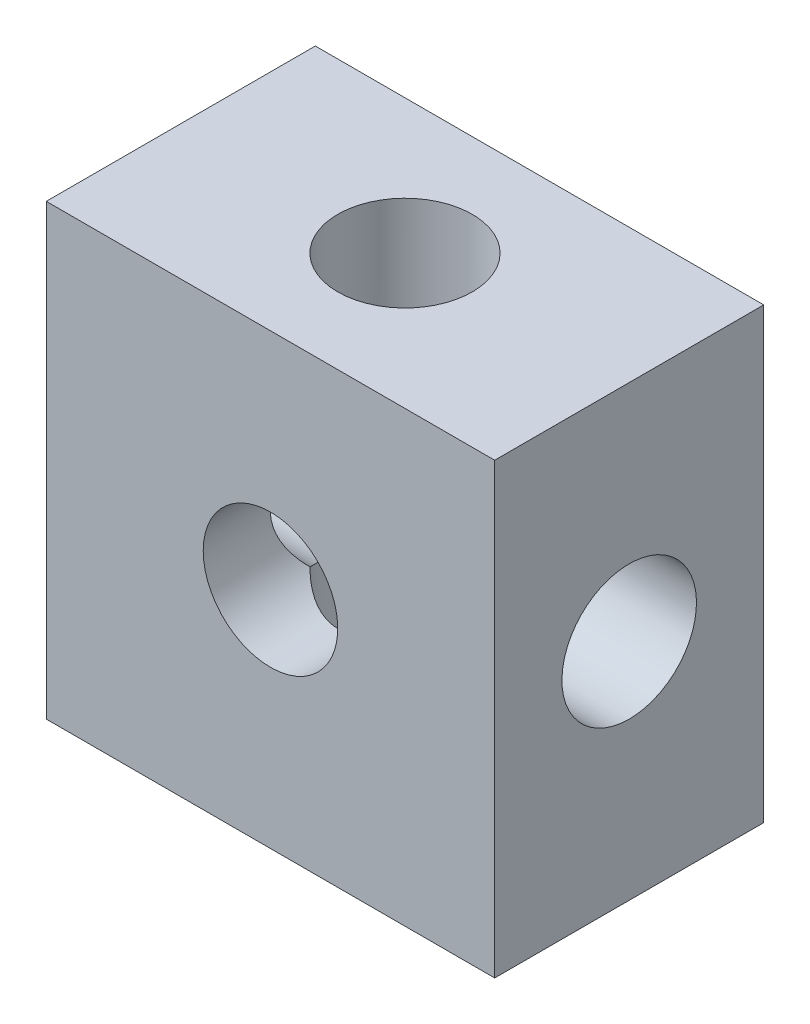
ISO-10303-21;
HEADER;
FILE_DESCRIPTION(('STEP AP214'),'2;1');
FILE_NAME('part.step','',(''),(''),'','','');
FILE_SCHEMA(('AUTOMOTIVE_DESIGN { 1 0 10303 214 1 1 1 1 }'));
ENDSEC;
DATA;
#1=APPLICATION_CONTEXT('core data for automotive mechanical design processes');
#2=APPLICATION_PROTOCOL_DEFINITION('international standard','automotive_design',2000,#1);
#3=PRODUCT_CONTEXT('',#1,'mechanical');
#4=PRODUCT('Part','Part','',(#3));
#5=PRODUCT_RELATED_PRODUCT_CATEGORY('part','',(#4));
#6=PRODUCT_DEFINITION_FORMATION('','',#4);
#7=PRODUCT_DEFINITION_CONTEXT('part definition',#1,'design');
#8=PRODUCT_DEFINITION('design','',#6,#7);
#9=PRODUCT_DEFINITION_SHAPE('','',#8);
#10=(LENGTH_UNIT() NAMED_UNIT(*) SI_UNIT(.MILLI.,.METRE.));
#11=(NAMED_UNIT(*) PLANE_ANGLE_UNIT() SI_UNIT($,.RADIAN.));
#12=(NAMED_UNIT(*) SI_UNIT($,.STERADIAN.) SOLID_ANGLE_UNIT());
#13=UNCERTAINTY_MEASURE_WITH_UNIT(LENGTH_MEASURE(1.E-05),#10,'distance_accuracy_value','');
#14=(GEOMETRIC_REPRESENTATION_CONTEXT(3) GLOBAL_UNCERTAINTY_ASSIGNED_CONTEXT((#13)) GLOBAL_UNIT_ASSIGNED_CONTEXT((#10,
#11,#12)) REPRESENTATION_CONTEXT('',''));
#15=CARTESIAN_POINT('',(0.,0.,0.));
#16=DIRECTION('',(0.,0.,1.));
#17=DIRECTION('',(1.,0.,0.));
#18=AXIS2_PLACEMENT_3D('',#15,#16,#17);
#19=CARTESIAN_POINT('',(0.,-5.,0.));
#20=DIRECTION('',(0.,1.,0.));
#21=DIRECTION('',(0.,0.,1.));
#22=AXIS2_PLACEMENT_3D('',#19,#20,#21);
#23=CYLINDRICAL_SURFACE('',#22,1.5);
#24=CARTESIAN_POINT('',(0.,5.,0.));
#25=DIRECTION('',(0.,1.,0.));
#26=DIRECTION('',(0.,0.,1.));
#27=AXIS2_PLACEMENT_3D('',#24,#25,#26);
#28=CIRCLE('',#27,1.5);
#29=CARTESIAN_POINT('',(0.,5.,1.5));
#30=VERTEX_POINT('',#29);
#31=EDGE_CURVE('E139',#30,#30,#28,.T.);
#32=ORIENTED_EDGE('',*,*,#31,.T.);
#33=EDGE_LOOP('',(#32));
#34=FACE_BOUND('',#33,.T.);
#35=CARTESIAN_POINT('',(0.,0.,0.));
#36=DIRECTION('',(-0.707106781186548,0.707106781186547,0.));
#37=DIRECTION('',(0.707106781186547,0.707106781186547,0.));
#38=AXIS2_PLACEMENT_3D('',#35,#36,#37);
#39=ELLIPSE('',#38,2.12132034355964,1.5);
#40=CARTESIAN_POINT('',(1.06066017177982,1.06066017177982,-1.06066017177982));
#41=VERTEX_POINT('',#40);
#42=CARTESIAN_POINT('',(1.06066017177982,1.06066017177982,1.06066017177982));
#43=VERTEX_POINT('',#42);
#44=EDGE_CURVE('E103',#41,#43,#39,.F.);
#45=ORIENTED_EDGE('',*,*,#44,.T.);
#46=CARTESIAN_POINT('',(0.,0.,0.));
#47=DIRECTION('',(0.,0.707106781186547,-0.707106781186547));
#48=DIRECTION('',(0.,0.707106781186547,0.707106781186547));
#49=AXIS2_PLACEMENT_3D('',#46,#47,#48);
#50=ELLIPSE('',#49,2.12132034355964,1.5);
#51=CARTESIAN_POINT('',(-1.06066017177982,1.06066017177982,1.06066017177982));
#52=VERTEX_POINT('',#51);
#53=EDGE_CURVE('E49',#43,#52,#50,.F.);
#54=ORIENTED_EDGE('',*,*,#53,.T.);
#55=CARTESIAN_POINT('',(0.,0.,0.));
#56=DIRECTION('',(0.707106781186547,0.707106781186547,0.));
#57=DIRECTION('',(-0.707106781186548,0.707106781186547,0.));
#58=AXIS2_PLACEMENT_3D('',#55,#56,#57);
#59=ELLIPSE('',#58,2.12132034355964,1.5);
#60=CARTESIAN_POINT('',(-1.06066017177982,1.06066017177982,-1.06066017177982));
#61=VERTEX_POINT('',#60);
#62=EDGE_CURVE('E115',#52,#61,#59,.F.);
#63=ORIENTED_EDGE('',*,*,#62,.T.);
#64=CARTESIAN_POINT('',(0.,0.,0.));
#65=DIRECTION('',(0.,0.707106781186547,0.707106781186547));
#66=DIRECTION('',(0.,0.707106781186547,-0.707106781186547));
#67=AXIS2_PLACEMENT_3D('',#64,#65,#66);
#68=ELLIPSE('',#67,2.12132034355964,1.5);
#69=EDGE_CURVE('E126',#61,#41,#68,.F.);
#70=ORIENTED_EDGE('',*,*,#69,.T.);
#71=EDGE_LOOP('',(#45,#54,#63,#70));
#72=FACE_BOUND('',#71,.T.);
#73=ADVANCED_FACE('F34',(#34,#72),#23,.F.);
#74=CARTESIAN_POINT('',(5.,5.,3.));
#75=DIRECTION('',(-1.,0.,0.));
#76=DIRECTION('',(0.,0.,1.));
#77=AXIS2_PLACEMENT_3D('',#74,#75,#76);
#78=PLANE('',#77);
#79=CARTESIAN_POINT('',(5.,0.,0.));
#80=DIRECTION('',(-1.,0.,0.));
#81=DIRECTION('',(0.,-1.,0.));
#82=AXIS2_PLACEMENT_3D('',#79,#80,#81);
#83=CIRCLE('',#82,1.5);
#84=CARTESIAN_POINT('',(5.,-1.5,0.));
#85=VERTEX_POINT('',#84);
#86=EDGE_CURVE('E136',#85,#85,#83,.T.);
#87=ORIENTED_EDGE('',*,*,#86,.T.);
#88=EDGE_LOOP('',(#87));
#89=FACE_BOUND('',#88,.T.);
#90=DIRECTION('',(0.,1.,0.));
#91=VECTOR('',#90,1.);
#92=CARTESIAN_POINT('',(5.,5.,-3.));
#93=LINE('',#92,#91);
#94=CARTESIAN_POINT('',(5.,-5.,-3.));
#95=VERTEX_POINT('',#94);
#96=CARTESIAN_POINT('',(5.,5.,-3.));
#97=VERTEX_POINT('',#96);
#98=EDGE_CURVE('E145',#95,#97,#93,.T.);
#99=ORIENTED_EDGE('',*,*,#98,.T.);
#100=DIRECTION('',(0.,0.,-1.));
#101=VECTOR('',#100,1.);
#102=CARTESIAN_POINT('',(5.,5.,3.));
#103=LINE('',#102,#101);
#104=CARTESIAN_POINT('',(5.,5.,3.));
#105=VERTEX_POINT('',#104);
#106=EDGE_CURVE('E119',#105,#97,#103,.T.);
#107=ORIENTED_EDGE('',*,*,#106,.F.);
#108=DIRECTION('',(0.,1.,0.));
#109=VECTOR('',#108,1.);
#110=CARTESIAN_POINT('',(5.,5.,3.));
#111=LINE('',#110,#109);
#112=CARTESIAN_POINT('',(5.,-5.,3.));
#113=VERTEX_POINT('',#112);
#114=EDGE_CURVE('E148',#113,#105,#111,.T.);
#115=ORIENTED_EDGE('',*,*,#114,.F.);
#116=DIRECTION('',(0.,0.,-1.));
#117=VECTOR('',#116,1.);
#118=CARTESIAN_POINT('',(5.,-5.,3.));
#119=LINE('',#118,#117);
#120=EDGE_CURVE('E158',#113,#95,#119,.T.);
#121=ORIENTED_EDGE('',*,*,#120,.T.);
#122=EDGE_LOOP('',(#99,#107,#115,#121));
#123=FACE_BOUND('',#122,.T.);
#124=ADVANCED_FACE('F36',(#89,#123),#78,.F.);
#125=CARTESIAN_POINT('',(-5.,5.,3.));
#126=DIRECTION('',(0.,-1.,0.));
#127=DIRECTION('',(0.,0.,-1.));
#128=AXIS2_PLACEMENT_3D('',#125,#126,#127);
#129=PLANE('',#128);
#130=ORIENTED_EDGE('',*,*,#31,.F.);
#131=EDGE_LOOP('',(#130));
#132=FACE_BOUND('',#131,.T.);
#133=DIRECTION('',(-1.,0.,0.));
#134=VECTOR('',#133,1.);
#135=CARTESIAN_POINT('',(-5.,5.,-3.));
#136=LINE('',#135,#134);
#137=CARTESIAN_POINT('',(-5.,5.,-3.));
#138=VERTEX_POINT('',#137);
#139=EDGE_CURVE('E161',#97,#138,#136,.T.);
#140=ORIENTED_EDGE('',*,*,#139,.T.);
#141=DIRECTION('',(0.,0.,-1.));
#142=VECTOR('',#141,1.);
#143=CARTESIAN_POINT('',(-5.,5.,3.));
#144=LINE('',#143,#142);
#145=CARTESIAN_POINT('',(-5.,5.,3.));
#146=VERTEX_POINT('',#145);
#147=EDGE_CURVE('E171',#146,#138,#144,.T.);
#148=ORIENTED_EDGE('',*,*,#147,.F.);
#149=DIRECTION('',(-1.,0.,0.));
#150=VECTOR('',#149,1.);
#151=CARTESIAN_POINT('',(-5.,5.,3.));
#152=LINE('',#151,#150);
#153=EDGE_CURVE('E151',#105,#146,#152,.T.);
#154=ORIENTED_EDGE('',*,*,#153,.F.);
#155=ORIENTED_EDGE('',*,*,#106,.T.);
#156=EDGE_LOOP('',(#140,#148,#154,#155));
#157=FACE_BOUND('',#156,.T.);
#158=ADVANCED_FACE('F176',(#132,#157),#129,.F.);
#159=CARTESIAN_POINT('',(-5.,5.,3.));
#160=DIRECTION('',(1.,0.,0.));
#161=DIRECTION('',(0.,1.,0.));
#162=AXIS2_PLACEMENT_3D('',#159,#160,#161);
#163=PLANE('',#162);
#164=CARTESIAN_POINT('',(-5.,0.,0.));
#165=DIRECTION('',(-1.,0.,0.));
#166=DIRECTION('',(0.,-1.,0.));
#167=AXIS2_PLACEMENT_3D('',#164,#165,#166);
#168=CIRCLE('',#167,1.5);
#169=CARTESIAN_POINT('',(-5.,-1.5,0.));
#170=VERTEX_POINT('',#169);
#171=EDGE_CURVE('E130',#170,#170,#168,.T.);
#172=ORIENTED_EDGE('',*,*,#171,.F.);
#173=EDGE_LOOP('',(#172));
#174=FACE_BOUND('',#173,.T.);
#175=DIRECTION('',(0.,-1.,0.));
#176=VECTOR('',#175,1.);
#177=CARTESIAN_POINT('',(-5.,5.,-3.));
#178=LINE('',#177,#176);
#179=CARTESIAN_POINT('',(-5.,-5.,-3.));
#180=VERTEX_POINT('',#179);
#181=EDGE_CURVE('E163',#138,#180,#178,.T.);
#182=ORIENTED_EDGE('',*,*,#181,.T.);
#183=DIRECTION('',(0.,0.,-1.));
#184=VECTOR('',#183,1.);
#185=CARTESIAN_POINT('',(-5.,-5.,3.));
#186=LINE('',#185,#184);
#187=CARTESIAN_POINT('',(-5.,-5.,3.));
#188=VERTEX_POINT('',#187);
#189=EDGE_CURVE('E168',#188,#180,#186,.T.);
#190=ORIENTED_EDGE('',*,*,#189,.F.);
#191=DIRECTION('',(0.,-1.,0.));
#192=VECTOR('',#191,1.);
#193=CARTESIAN_POINT('',(-5.,5.,3.));
#194=LINE('',#193,#192);
#195=EDGE_CURVE('E154',#146,#188,#194,.T.);
#196=ORIENTED_EDGE('',*,*,#195,.F.);
#197=ORIENTED_EDGE('',*,*,#147,.T.);
#198=EDGE_LOOP('',(#182,#190,#196,#197));
#199=FACE_BOUND('',#198,.T.);
#200=ADVANCED_FACE('F188',(#174,#199),#163,.F.);
#201=CARTESIAN_POINT('',(-5.,-5.,3.));
#202=DIRECTION('',(0.,1.,0.));
#203=DIRECTION('',(0.,0.,1.));
#204=AXIS2_PLACEMENT_3D('',#201,#202,#203);
#205=PLANE('',#204);
#206=CARTESIAN_POINT('',(0.,-5.,0.));
#207=DIRECTION('',(0.,1.,0.));
#208=DIRECTION('',(0.,0.,1.));
#209=AXIS2_PLACEMENT_3D('',#206,#207,#208);
#210=CIRCLE('',#209,1.5);
#211=CARTESIAN_POINT('',(0.,-5.,1.5));
#212=VERTEX_POINT('',#211);
#213=EDGE_CURVE('E142',#212,#212,#210,.T.);
#214=ORIENTED_EDGE('',*,*,#213,.T.);
#215=EDGE_LOOP('',(#214));
#216=FACE_BOUND('',#215,.T.);
#217=DIRECTION('',(1.,0.,0.));
#218=VECTOR('',#217,1.);
#219=CARTESIAN_POINT('',(-5.,-5.,-3.));
#220=LINE('',#219,#218);
#221=EDGE_CURVE('E152',#180,#95,#220,.T.);
#222=ORIENTED_EDGE('',*,*,#221,.T.);
#223=ORIENTED_EDGE('',*,*,#120,.F.);
#224=DIRECTION('',(1.,0.,0.));
#225=VECTOR('',#224,1.);
#226=CARTESIAN_POINT('',(-5.,-5.,3.));
#227=LINE('',#226,#225);
#228=EDGE_CURVE('E156',#188,#113,#227,.T.);
#229=ORIENTED_EDGE('',*,*,#228,.F.);
#230=ORIENTED_EDGE('',*,*,#189,.T.);
#231=EDGE_LOOP('',(#222,#223,#229,#230));
#232=FACE_BOUND('',#231,.T.);
#233=ADVANCED_FACE('F192',(#216,#232),#205,.F.);
#234=CARTESIAN_POINT('',(0.,0.,3.));
#235=DIRECTION('',(0.,0.,1.));
#236=DIRECTION('',(1.,0.,0.));
#237=AXIS2_PLACEMENT_3D('',#234,#235,#236);
#238=PLANE('',#237);
#239=CARTESIAN_POINT('',(0.,0.,3.));
#240=DIRECTION('',(0.,0.,-1.));
#241=DIRECTION('',(-1.,0.,0.));
#242=AXIS2_PLACEMENT_3D('',#239,#240,#241);
#243=CIRCLE('',#242,1.5);
#244=CARTESIAN_POINT('',(-1.5,0.,3.));
#245=VERTEX_POINT('',#244);
#246=EDGE_CURVE('E112',#245,#245,#243,.T.);
#247=ORIENTED_EDGE('',*,*,#246,.T.);
#248=EDGE_LOOP('',(#247));
#249=FACE_BOUND('',#248,.T.);
#250=ORIENTED_EDGE('',*,*,#114,.T.);
#251=ORIENTED_EDGE('',*,*,#153,.T.);
#252=ORIENTED_EDGE('',*,*,#195,.T.);
#253=ORIENTED_EDGE('',*,*,#228,.T.);
#254=EDGE_LOOP('',(#250,#251,#252,#253));
#255=FACE_BOUND('',#254,.T.);
#256=ADVANCED_FACE('F194',(#249,#255),#238,.T.);
#257=CARTESIAN_POINT('',(0.,0.,-3.));
#258=DIRECTION('',(0.,0.,1.));
#259=DIRECTION('',(1.,0.,0.));
#260=AXIS2_PLACEMENT_3D('',#257,#258,#259);
#261=PLANE('',#260);
#262=CARTESIAN_POINT('',(0.,0.,-3.));
#263=DIRECTION('',(0.,0.,-1.));
#264=DIRECTION('',(-1.,0.,0.));
#265=AXIS2_PLACEMENT_3D('',#262,#263,#264);
#266=CIRCLE('',#265,1.5);
#267=CARTESIAN_POINT('',(-1.5,0.,-3.));
#268=VERTEX_POINT('',#267);
#269=EDGE_CURVE('E236',#268,#268,#266,.T.);
#270=ORIENTED_EDGE('',*,*,#269,.F.);
#271=EDGE_LOOP('',(#270));
#272=FACE_BOUND('',#271,.T.);
#273=ORIENTED_EDGE('',*,*,#98,.F.);
#274=ORIENTED_EDGE('',*,*,#221,.F.);
#275=ORIENTED_EDGE('',*,*,#181,.F.);
#276=ORIENTED_EDGE('',*,*,#139,.F.);
#277=EDGE_LOOP('',(#273,#274,#275,#276));
#278=FACE_BOUND('',#277,.T.);
#279=ADVANCED_FACE('F184',(#272,#278),#261,.F.);
#280=CARTESIAN_POINT('',(0.,0.,0.));
#281=DIRECTION('',(0.707106781186547,0.707106781186547,0.));
#282=DIRECTION('',(-0.707106781186548,0.707106781186547,0.));
#283=AXIS2_PLACEMENT_3D('',#280,#281,#282);
#284=ELLIPSE('',#283,2.12132034355964,1.5);
#285=CARTESIAN_POINT('',(1.06066017177982,-1.06066017177982,1.06066017177982));
#286=VERTEX_POINT('',#285);
#287=CARTESIAN_POINT('',(1.06066017177982,-1.06066017177982,-1.06066017177982));
#288=VERTEX_POINT('',#287);
#289=EDGE_CURVE('E109',#286,#288,#284,.T.);
#290=ORIENTED_EDGE('',*,*,#289,.T.);
#291=CARTESIAN_POINT('',(0.,0.,0.));
#292=DIRECTION('',(0.,0.707106781186547,-0.707106781186547));
#293=DIRECTION('',(0.,0.707106781186547,0.707106781186547));
#294=AXIS2_PLACEMENT_3D('',#291,#292,#293);
#295=ELLIPSE('',#294,2.12132034355964,1.5);
#296=CARTESIAN_POINT('',(-1.06066017177982,-1.06066017177982,-1.06066017177982));
#297=VERTEX_POINT('',#296);
#298=EDGE_CURVE('E57',#288,#297,#295,.T.);
#299=ORIENTED_EDGE('',*,*,#298,.T.);
#300=CARTESIAN_POINT('',(0.,0.,0.));
#301=DIRECTION('',(-0.707106781186548,0.707106781186547,0.));
#302=DIRECTION('',(0.707106781186547,0.707106781186547,0.));
#303=AXIS2_PLACEMENT_3D('',#300,#301,#302);
#304=ELLIPSE('',#303,2.12132034355964,1.5);
#305=CARTESIAN_POINT('',(-1.06066017177982,-1.06066017177982,1.06066017177982));
#306=VERTEX_POINT('',#305);
#307=EDGE_CURVE('E111',#297,#306,#304,.T.);
#308=ORIENTED_EDGE('',*,*,#307,.T.);
#309=CARTESIAN_POINT('',(0.,0.,0.));
#310=DIRECTION('',(0.,0.707106781186547,0.707106781186547));
#311=DIRECTION('',(0.,0.707106781186547,-0.707106781186547));
#312=AXIS2_PLACEMENT_3D('',#309,#310,#311);
#313=ELLIPSE('',#312,2.12132034355964,1.5);
#314=EDGE_CURVE('E97',#306,#286,#313,.T.);
#315=ORIENTED_EDGE('',*,*,#314,.T.);
#316=EDGE_LOOP('',(#290,#299,#308,#315));
#317=FACE_BOUND('',#316,.T.);
#318=ORIENTED_EDGE('',*,*,#213,.F.);
#319=EDGE_LOOP('',(#318));
#320=FACE_BOUND('',#319,.T.);
#321=ADVANCED_FACE('F107',(#317,#320),#23,.F.);
#322=CARTESIAN_POINT('',(5.,0.,0.));
#323=DIRECTION('',(-1.,0.,0.));
#324=DIRECTION('',(0.,-1.,0.));
#325=AXIS2_PLACEMENT_3D('',#322,#323,#324);
#326=CYLINDRICAL_SURFACE('',#325,1.5);
#327=ORIENTED_EDGE('',*,*,#171,.T.);
#328=EDGE_LOOP('',(#327));
#329=FACE_BOUND('',#328,.T.);
#330=ORIENTED_EDGE('',*,*,#62,.F.);
#331=CARTESIAN_POINT('',(0.,0.,0.));
#332=DIRECTION('',(-0.707106781186547,0.,-0.707106781186547));
#333=DIRECTION('',(-0.707106781186547,0.,0.707106781186547));
#334=AXIS2_PLACEMENT_3D('',#331,#332,#333);
#335=ELLIPSE('',#334,2.12132034355964,1.5);
#336=EDGE_CURVE('E132',#52,#306,#335,.F.);
#337=ORIENTED_EDGE('',*,*,#336,.T.);
#338=ORIENTED_EDGE('',*,*,#307,.F.);
#339=CARTESIAN_POINT('',(0.,0.,0.));
#340=DIRECTION('',(-0.707106781186547,0.,0.707106781186547));
#341=DIRECTION('',(-0.707106781186547,0.,-0.707106781186547));
#342=AXIS2_PLACEMENT_3D('',#339,#340,#341);
#343=ELLIPSE('',#342,2.12132034355964,1.5);
#344=EDGE_CURVE('E128',#297,#61,#343,.F.);
#345=ORIENTED_EDGE('',*,*,#344,.T.);
#346=EDGE_LOOP('',(#330,#337,#338,#345));
#347=FACE_BOUND('',#346,.T.);
#348=ADVANCED_FACE('F216',(#329,#347),#326,.F.);
#349=ORIENTED_EDGE('',*,*,#86,.F.);
#350=EDGE_LOOP('',(#349));
#351=FACE_BOUND('',#350,.T.);
#352=ORIENTED_EDGE('',*,*,#44,.F.);
#353=CARTESIAN_POINT('',(0.,0.,0.));
#354=DIRECTION('',(-0.707106781186547,0.,-0.707106781186547));
#355=DIRECTION('',(-0.707106781186547,0.,0.707106781186547));
#356=AXIS2_PLACEMENT_3D('',#353,#354,#355);
#357=ELLIPSE('',#356,2.12132034355964,1.5);
#358=EDGE_CURVE('E11',#41,#288,#357,.T.);
#359=ORIENTED_EDGE('',*,*,#358,.T.);
#360=ORIENTED_EDGE('',*,*,#289,.F.);
#361=CARTESIAN_POINT('',(0.,0.,0.));
#362=DIRECTION('',(-0.707106781186547,0.,0.707106781186547));
#363=DIRECTION('',(-0.707106781186547,0.,-0.707106781186547));
#364=AXIS2_PLACEMENT_3D('',#361,#362,#363);
#365=ELLIPSE('',#364,2.12132034355964,1.5);
#366=EDGE_CURVE('E42',#286,#43,#365,.T.);
#367=ORIENTED_EDGE('',*,*,#366,.T.);
#368=EDGE_LOOP('',(#352,#359,#360,#367));
#369=FACE_BOUND('',#368,.T.);
#370=ADVANCED_FACE('F114',(#351,#369),#326,.F.);
#371=CARTESIAN_POINT('',(0.,0.,3.));
#372=DIRECTION('',(0.,0.,-1.));
#373=DIRECTION('',(-1.,0.,0.));
#374=AXIS2_PLACEMENT_3D('',#371,#372,#373);
#375=CYLINDRICAL_SURFACE('',#374,1.5);
#376=ORIENTED_EDGE('',*,*,#246,.F.);
#377=EDGE_LOOP('',(#376));
#378=FACE_BOUND('',#377,.T.);
#379=ORIENTED_EDGE('',*,*,#53,.F.);
#380=ORIENTED_EDGE('',*,*,#366,.F.);
#381=ORIENTED_EDGE('',*,*,#314,.F.);
#382=ORIENTED_EDGE('',*,*,#336,.F.);
#383=EDGE_LOOP('',(#379,#380,#381,#382));
#384=FACE_BOUND('',#383,.T.);
#385=ADVANCED_FACE('F96',(#378,#384),#375,.F.);
#386=ORIENTED_EDGE('',*,*,#269,.T.);
#387=EDGE_LOOP('',(#386));
#388=FACE_BOUND('',#387,.T.);
#389=ORIENTED_EDGE('',*,*,#298,.F.);
#390=ORIENTED_EDGE('',*,*,#358,.F.);
#391=ORIENTED_EDGE('',*,*,#69,.F.);
#392=ORIENTED_EDGE('',*,*,#344,.F.);
#393=EDGE_LOOP('',(#389,#390,#391,#392));
#394=FACE_BOUND('',#393,.T.);
#395=ADVANCED_FACE('F227',(#388,#394),#375,.F.);
#396=CLOSED_SHELL('',(#73,#124,#158,#200,#233,#256,#279,#321,#348,#370,#385,#395));
#397=MANIFOLD_SOLID_BREP('B2',#396);
#398=ADVANCED_BREP_SHAPE_REPRESENTATION('',(#18,#397),#14);
#399=SHAPE_DEFINITION_REPRESENTATION(#9,#398);
ENDSEC;
END-ISO-10303-21;
